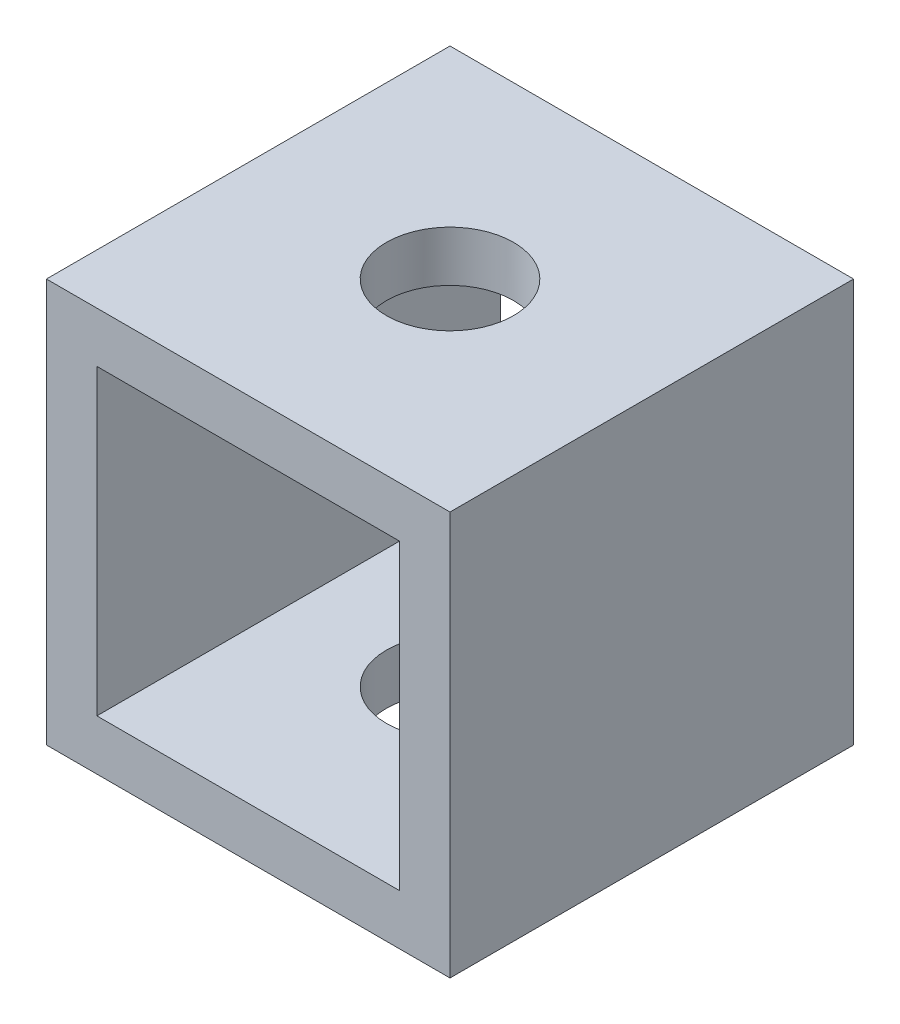
ISO-10303-21;
HEADER;
FILE_DESCRIPTION(('STEP AP214'),'2;1');
FILE_NAME('part.step','',(''),(''),'','','');
FILE_SCHEMA(('AUTOMOTIVE_DESIGN { 1 0 10303 214 1 1 1 1 }'));
ENDSEC;
DATA;
#1=APPLICATION_CONTEXT('core data for automotive mechanical design processes');
#2=APPLICATION_PROTOCOL_DEFINITION('international standard','automotive_design',2000,#1);
#3=PRODUCT_CONTEXT('',#1,'mechanical');
#4=PRODUCT('Part','Part','',(#3));
#5=PRODUCT_RELATED_PRODUCT_CATEGORY('part','',(#4));
#6=PRODUCT_DEFINITION_FORMATION('','',#4);
#7=PRODUCT_DEFINITION_CONTEXT('part definition',#1,'design');
#8=PRODUCT_DEFINITION('design','',#6,#7);
#9=PRODUCT_DEFINITION_SHAPE('','',#8);
#10=(LENGTH_UNIT() NAMED_UNIT(*) SI_UNIT(.MILLI.,.METRE.));
#11=(NAMED_UNIT(*) PLANE_ANGLE_UNIT() SI_UNIT($,.RADIAN.));
#12=(NAMED_UNIT(*) SI_UNIT($,.STERADIAN.) SOLID_ANGLE_UNIT());
#13=UNCERTAINTY_MEASURE_WITH_UNIT(LENGTH_MEASURE(1.E-05),#10,'distance_accuracy_value','');
#14=(GEOMETRIC_REPRESENTATION_CONTEXT(3) GLOBAL_UNCERTAINTY_ASSIGNED_CONTEXT((#13)) GLOBAL_UNIT_ASSIGNED_CONTEXT((#10,
#11,#12)) REPRESENTATION_CONTEXT('',''));
#15=CARTESIAN_POINT('',(0.,0.,0.));
#16=DIRECTION('',(0.,0.,1.));
#17=DIRECTION('',(1.,0.,0.));
#18=AXIS2_PLACEMENT_3D('',#15,#16,#17);
#19=CARTESIAN_POINT('',(0.,0.,25.4));
#20=DIRECTION('',(0.,0.,1.));
#21=DIRECTION('',(1.,0.,0.));
#22=AXIS2_PLACEMENT_3D('',#19,#20,#21);
#23=PLANE('',#22);
#24=DIRECTION('',(0.,1.,0.));
#25=VECTOR('',#24,1.);
#26=CARTESIAN_POINT('',(0.,0.,25.4));
#27=LINE('',#26,#25);
#28=CARTESIAN_POINT('',(0.,0.,25.4));
#29=VERTEX_POINT('',#28);
#30=CARTESIAN_POINT('',(0.,25.4,25.4));
#31=VERTEX_POINT('',#30);
#32=EDGE_CURVE('E156',#29,#31,#27,.T.);
#33=ORIENTED_EDGE('',*,*,#32,.T.);
#34=DIRECTION('',(-1.,0.,0.));
#35=VECTOR('',#34,1.);
#36=CARTESIAN_POINT('',(0.,25.4,25.4));
#37=LINE('',#36,#35);
#38=CARTESIAN_POINT('',(-25.4,25.4,25.4));
#39=VERTEX_POINT('',#38);
#40=EDGE_CURVE('E160',#31,#39,#37,.T.);
#41=ORIENTED_EDGE('',*,*,#40,.T.);
#42=DIRECTION('',(0.,-1.,0.));
#43=VECTOR('',#42,1.);
#44=CARTESIAN_POINT('',(-25.4,0.,25.4));
#45=LINE('',#44,#43);
#46=CARTESIAN_POINT('',(-25.4,0.,25.4));
#47=VERTEX_POINT('',#46);
#48=EDGE_CURVE('E164',#39,#47,#45,.T.);
#49=ORIENTED_EDGE('',*,*,#48,.T.);
#50=DIRECTION('',(1.,0.,0.));
#51=VECTOR('',#50,1.);
#52=CARTESIAN_POINT('',(0.,0.,25.4));
#53=LINE('',#52,#51);
#54=EDGE_CURVE('E167',#47,#29,#53,.T.);
#55=ORIENTED_EDGE('',*,*,#54,.T.);
#56=EDGE_LOOP('',(#33,#41,#49,#55));
#57=FACE_BOUND('',#56,.T.);
#58=DIRECTION('',(1.,0.,0.));
#59=VECTOR('',#58,1.);
#60=CARTESIAN_POINT('',(-22.225,3.175,25.4));
#61=LINE('',#60,#59);
#62=CARTESIAN_POINT('',(-22.225,3.175,25.4));
#63=VERTEX_POINT('',#62);
#64=CARTESIAN_POINT('',(-3.175,3.175,25.4));
#65=VERTEX_POINT('',#64);
#66=EDGE_CURVE('E115',#63,#65,#61,.T.);
#67=ORIENTED_EDGE('',*,*,#66,.F.);
#68=DIRECTION('',(0.,-1.,0.));
#69=VECTOR('',#68,1.);
#70=CARTESIAN_POINT('',(-22.225,22.225,25.4));
#71=LINE('',#70,#69);
#72=CARTESIAN_POINT('',(-22.225,22.225,25.4));
#73=VERTEX_POINT('',#72);
#74=EDGE_CURVE('E106',#73,#63,#71,.T.);
#75=ORIENTED_EDGE('',*,*,#74,.F.);
#76=DIRECTION('',(-1.,0.,0.));
#77=VECTOR('',#76,1.);
#78=CARTESIAN_POINT('',(-22.225,22.225,25.4));
#79=LINE('',#78,#77);
#80=CARTESIAN_POINT('',(-3.175,22.225,25.4));
#81=VERTEX_POINT('',#80);
#82=EDGE_CURVE('E132',#81,#73,#79,.T.);
#83=ORIENTED_EDGE('',*,*,#82,.F.);
#84=DIRECTION('',(0.,1.,0.));
#85=VECTOR('',#84,1.);
#86=CARTESIAN_POINT('',(-3.175,22.225,25.4));
#87=LINE('',#86,#85);
#88=EDGE_CURVE('E128',#65,#81,#87,.T.);
#89=ORIENTED_EDGE('',*,*,#88,.F.);
#90=EDGE_LOOP('',(#67,#75,#83,#89));
#91=FACE_BOUND('',#90,.T.);
#92=ADVANCED_FACE('F39',(#57,#91),#23,.T.);
#93=CARTESIAN_POINT('',(0.,0.,0.));
#94=DIRECTION('',(0.,0.,1.));
#95=DIRECTION('',(1.,0.,0.));
#96=AXIS2_PLACEMENT_3D('',#93,#94,#95);
#97=PLANE('',#96);
#98=DIRECTION('',(0.,1.,0.));
#99=VECTOR('',#98,1.);
#100=CARTESIAN_POINT('',(0.,0.,0.));
#101=LINE('',#100,#99);
#102=CARTESIAN_POINT('',(0.,0.,0.));
#103=VERTEX_POINT('',#102);
#104=CARTESIAN_POINT('',(0.,25.4,0.));
#105=VERTEX_POINT('',#104);
#106=EDGE_CURVE('E124',#103,#105,#101,.T.);
#107=ORIENTED_EDGE('',*,*,#106,.F.);
#108=DIRECTION('',(1.,0.,0.));
#109=VECTOR('',#108,1.);
#110=CARTESIAN_POINT('',(0.,0.,0.));
#111=LINE('',#110,#109);
#112=CARTESIAN_POINT('',(-25.4,0.,0.));
#113=VERTEX_POINT('',#112);
#114=EDGE_CURVE('E161',#113,#103,#111,.T.);
#115=ORIENTED_EDGE('',*,*,#114,.F.);
#116=DIRECTION('',(0.,-1.,0.));
#117=VECTOR('',#116,1.);
#118=CARTESIAN_POINT('',(-25.4,0.,0.));
#119=LINE('',#118,#117);
#120=CARTESIAN_POINT('',(-25.4,25.4,0.));
#121=VERTEX_POINT('',#120);
#122=EDGE_CURVE('E177',#121,#113,#119,.T.);
#123=ORIENTED_EDGE('',*,*,#122,.F.);
#124=DIRECTION('',(-1.,0.,0.));
#125=VECTOR('',#124,1.);
#126=CARTESIAN_POINT('',(0.,25.4,0.));
#127=LINE('',#126,#125);
#128=EDGE_CURVE('E174',#105,#121,#127,.T.);
#129=ORIENTED_EDGE('',*,*,#128,.F.);
#130=EDGE_LOOP('',(#107,#115,#123,#129));
#131=FACE_BOUND('',#130,.T.);
#132=DIRECTION('',(0.,-1.,0.));
#133=VECTOR('',#132,1.);
#134=CARTESIAN_POINT('',(-22.225,22.225,0.));
#135=LINE('',#134,#133);
#136=CARTESIAN_POINT('',(-22.225,22.225,0.));
#137=VERTEX_POINT('',#136);
#138=CARTESIAN_POINT('',(-22.225,3.175,0.));
#139=VERTEX_POINT('',#138);
#140=EDGE_CURVE('E64',#137,#139,#135,.T.);
#141=ORIENTED_EDGE('',*,*,#140,.T.);
#142=DIRECTION('',(1.,0.,0.));
#143=VECTOR('',#142,1.);
#144=CARTESIAN_POINT('',(-22.225,3.175,0.));
#145=LINE('',#144,#143);
#146=CARTESIAN_POINT('',(-3.175,3.175,0.));
#147=VERTEX_POINT('',#146);
#148=EDGE_CURVE('E122',#139,#147,#145,.T.);
#149=ORIENTED_EDGE('',*,*,#148,.T.);
#150=DIRECTION('',(0.,1.,0.));
#151=VECTOR('',#150,1.);
#152=CARTESIAN_POINT('',(-3.175,22.225,0.));
#153=LINE('',#152,#151);
#154=CARTESIAN_POINT('',(-3.175,22.225,0.));
#155=VERTEX_POINT('',#154);
#156=EDGE_CURVE('E143',#147,#155,#153,.T.);
#157=ORIENTED_EDGE('',*,*,#156,.T.);
#158=DIRECTION('',(-1.,0.,0.));
#159=VECTOR('',#158,1.);
#160=CARTESIAN_POINT('',(-22.225,22.225,0.));
#161=LINE('',#160,#159);
#162=EDGE_CURVE('E116',#155,#137,#161,.T.);
#163=ORIENTED_EDGE('',*,*,#162,.T.);
#164=EDGE_LOOP('',(#141,#149,#157,#163));
#165=FACE_BOUND('',#164,.T.);
#166=ADVANCED_FACE('F201',(#131,#165),#97,.F.);
#167=CARTESIAN_POINT('',(0.,0.,25.4));
#168=DIRECTION('',(-1.,0.,0.));
#169=DIRECTION('',(0.,-1.,0.));
#170=AXIS2_PLACEMENT_3D('',#167,#168,#169);
#171=PLANE('',#170);
#172=ORIENTED_EDGE('',*,*,#106,.T.);
#173=DIRECTION('',(0.,0.,-1.));
#174=VECTOR('',#173,1.);
#175=CARTESIAN_POINT('',(0.,25.4,25.4));
#176=LINE('',#175,#174);
#177=EDGE_CURVE('E11',#31,#105,#176,.T.);
#178=ORIENTED_EDGE('',*,*,#177,.F.);
#179=ORIENTED_EDGE('',*,*,#32,.F.);
#180=DIRECTION('',(0.,0.,-1.));
#181=VECTOR('',#180,1.);
#182=CARTESIAN_POINT('',(0.,0.,25.4));
#183=LINE('',#182,#181);
#184=EDGE_CURVE('E170',#29,#103,#183,.T.);
#185=ORIENTED_EDGE('',*,*,#184,.T.);
#186=EDGE_LOOP('',(#172,#178,#179,#185));
#187=FACE_BOUND('',#186,.T.);
#188=ADVANCED_FACE('F41',(#187),#171,.F.);
#189=CARTESIAN_POINT('',(0.,25.4,25.4));
#190=DIRECTION('',(0.,-1.,0.));
#191=DIRECTION('',(1.,0.,0.));
#192=AXIS2_PLACEMENT_3D('',#189,#190,#191);
#193=PLANE('',#192);
#194=CARTESIAN_POINT('',(-12.7,25.4,12.7));
#195=DIRECTION('',(0.,1.,0.));
#196=DIRECTION('',(-1.,0.,0.));
#197=AXIS2_PLACEMENT_3D('',#194,#195,#196);
#198=CIRCLE('',#197,4.);
#199=CARTESIAN_POINT('',(-16.7,25.4,12.7));
#200=VERTEX_POINT('',#199);
#201=EDGE_CURVE('E239',#200,#200,#198,.T.);
#202=ORIENTED_EDGE('',*,*,#201,.F.);
#203=EDGE_LOOP('',(#202));
#204=FACE_BOUND('',#203,.T.);
#205=ORIENTED_EDGE('',*,*,#128,.T.);
#206=DIRECTION('',(0.,0.,-1.));
#207=VECTOR('',#206,1.);
#208=CARTESIAN_POINT('',(-25.4,25.4,25.4));
#209=LINE('',#208,#207);
#210=EDGE_CURVE('E49',#39,#121,#209,.T.);
#211=ORIENTED_EDGE('',*,*,#210,.F.);
#212=ORIENTED_EDGE('',*,*,#40,.F.);
#213=ORIENTED_EDGE('',*,*,#177,.T.);
#214=EDGE_LOOP('',(#205,#211,#212,#213));
#215=FACE_BOUND('',#214,.T.);
#216=ADVANCED_FACE('F211',(#204,#215),#193,.F.);
#217=CARTESIAN_POINT('',(-25.4,0.,25.4));
#218=DIRECTION('',(1.,0.,0.));
#219=DIRECTION('',(0.,0.,-1.));
#220=AXIS2_PLACEMENT_3D('',#217,#218,#219);
#221=PLANE('',#220);
#222=ORIENTED_EDGE('',*,*,#122,.T.);
#223=DIRECTION('',(0.,0.,-1.));
#224=VECTOR('',#223,1.);
#225=CARTESIAN_POINT('',(-25.4,0.,25.4));
#226=LINE('',#225,#224);
#227=EDGE_CURVE('E185',#47,#113,#226,.T.);
#228=ORIENTED_EDGE('',*,*,#227,.F.);
#229=ORIENTED_EDGE('',*,*,#48,.F.);
#230=ORIENTED_EDGE('',*,*,#210,.T.);
#231=EDGE_LOOP('',(#222,#228,#229,#230));
#232=FACE_BOUND('',#231,.T.);
#233=ADVANCED_FACE('F195',(#232),#221,.F.);
#234=CARTESIAN_POINT('',(0.,0.,25.4));
#235=DIRECTION('',(0.,1.,0.));
#236=DIRECTION('',(0.,0.,1.));
#237=AXIS2_PLACEMENT_3D('',#234,#235,#236);
#238=PLANE('',#237);
#239=CARTESIAN_POINT('',(-12.7,0.,12.7));
#240=DIRECTION('',(0.,1.,0.));
#241=DIRECTION('',(-1.,0.,0.));
#242=AXIS2_PLACEMENT_3D('',#239,#240,#241);
#243=CIRCLE('',#242,4.);
#244=CARTESIAN_POINT('',(-16.7,0.,12.7));
#245=VERTEX_POINT('',#244);
#246=EDGE_CURVE('E236',#245,#245,#243,.T.);
#247=ORIENTED_EDGE('',*,*,#246,.T.);
#248=EDGE_LOOP('',(#247));
#249=FACE_BOUND('',#248,.T.);
#250=ORIENTED_EDGE('',*,*,#114,.T.);
#251=ORIENTED_EDGE('',*,*,#184,.F.);
#252=ORIENTED_EDGE('',*,*,#54,.F.);
#253=ORIENTED_EDGE('',*,*,#227,.T.);
#254=EDGE_LOOP('',(#250,#251,#252,#253));
#255=FACE_BOUND('',#254,.T.);
#256=ADVANCED_FACE('F205',(#249,#255),#238,.F.);
#257=CARTESIAN_POINT('',(-22.225,22.225,25.4));
#258=DIRECTION('',(1.,0.,0.));
#259=DIRECTION('',(0.,1.,0.));
#260=AXIS2_PLACEMENT_3D('',#257,#258,#259);
#261=PLANE('',#260);
#262=ORIENTED_EDGE('',*,*,#140,.F.);
#263=DIRECTION('',(0.,0.,-1.));
#264=VECTOR('',#263,1.);
#265=CARTESIAN_POINT('',(-22.225,22.225,25.4));
#266=LINE('',#265,#264);
#267=EDGE_CURVE('E110',#73,#137,#266,.T.);
#268=ORIENTED_EDGE('',*,*,#267,.F.);
#269=ORIENTED_EDGE('',*,*,#74,.T.);
#270=DIRECTION('',(0.,0.,-1.));
#271=VECTOR('',#270,1.);
#272=CARTESIAN_POINT('',(-22.225,3.175,25.4));
#273=LINE('',#272,#271);
#274=EDGE_CURVE('E109',#63,#139,#273,.T.);
#275=ORIENTED_EDGE('',*,*,#274,.T.);
#276=EDGE_LOOP('',(#262,#268,#269,#275));
#277=FACE_BOUND('',#276,.T.);
#278=ADVANCED_FACE('F108',(#277),#261,.T.);
#279=CARTESIAN_POINT('',(-22.225,3.175,25.4));
#280=DIRECTION('',(0.,1.,0.));
#281=DIRECTION('',(0.,0.,1.));
#282=AXIS2_PLACEMENT_3D('',#279,#280,#281);
#283=PLANE('',#282);
#284=CARTESIAN_POINT('',(-12.7,3.175,12.7));
#285=DIRECTION('',(0.,1.,0.));
#286=DIRECTION('',(0.,0.,1.));
#287=AXIS2_PLACEMENT_3D('',#284,#285,#286);
#288=CIRCLE('',#287,4.);
#289=CARTESIAN_POINT('',(-12.7,3.175,16.7));
#290=VERTEX_POINT('',#289);
#291=EDGE_CURVE('E140',#290,#290,#288,.T.);
#292=ORIENTED_EDGE('',*,*,#291,.F.);
#293=EDGE_LOOP('',(#292));
#294=FACE_BOUND('',#293,.T.);
#295=ORIENTED_EDGE('',*,*,#148,.F.);
#296=ORIENTED_EDGE('',*,*,#274,.F.);
#297=ORIENTED_EDGE('',*,*,#66,.T.);
#298=DIRECTION('',(0.,0.,-1.));
#299=VECTOR('',#298,1.);
#300=CARTESIAN_POINT('',(-3.175,3.175,25.4));
#301=LINE('',#300,#299);
#302=EDGE_CURVE('E125',#65,#147,#301,.T.);
#303=ORIENTED_EDGE('',*,*,#302,.T.);
#304=EDGE_LOOP('',(#295,#296,#297,#303));
#305=FACE_BOUND('',#304,.T.);
#306=ADVANCED_FACE('F119',(#294,#305),#283,.T.);
#307=CARTESIAN_POINT('',(-3.175,22.225,25.4));
#308=DIRECTION('',(-1.,0.,0.));
#309=DIRECTION('',(0.,-1.,0.));
#310=AXIS2_PLACEMENT_3D('',#307,#308,#309);
#311=PLANE('',#310);
#312=ORIENTED_EDGE('',*,*,#156,.F.);
#313=ORIENTED_EDGE('',*,*,#302,.F.);
#314=ORIENTED_EDGE('',*,*,#88,.T.);
#315=DIRECTION('',(0.,0.,-1.));
#316=VECTOR('',#315,1.);
#317=CARTESIAN_POINT('',(-3.175,22.225,25.4));
#318=LINE('',#317,#316);
#319=EDGE_CURVE('E56',#81,#155,#318,.T.);
#320=ORIENTED_EDGE('',*,*,#319,.T.);
#321=EDGE_LOOP('',(#312,#313,#314,#320));
#322=FACE_BOUND('',#321,.T.);
#323=ADVANCED_FACE('F253',(#322),#311,.T.);
#324=CARTESIAN_POINT('',(-22.225,22.225,25.4));
#325=DIRECTION('',(0.,-1.,0.));
#326=DIRECTION('',(0.,0.,-1.));
#327=AXIS2_PLACEMENT_3D('',#324,#325,#326);
#328=PLANE('',#327);
#329=CARTESIAN_POINT('',(-12.7,22.225,12.7));
#330=DIRECTION('',(0.,-1.,0.));
#331=DIRECTION('',(0.,0.,-1.));
#332=AXIS2_PLACEMENT_3D('',#329,#330,#331);
#333=CIRCLE('',#332,4.);
#334=CARTESIAN_POINT('',(-12.7,22.225,8.7));
#335=VERTEX_POINT('',#334);
#336=EDGE_CURVE('E43',#335,#335,#333,.T.);
#337=ORIENTED_EDGE('',*,*,#336,.F.);
#338=EDGE_LOOP('',(#337));
#339=FACE_BOUND('',#338,.T.);
#340=ORIENTED_EDGE('',*,*,#162,.F.);
#341=ORIENTED_EDGE('',*,*,#319,.F.);
#342=ORIENTED_EDGE('',*,*,#82,.T.);
#343=ORIENTED_EDGE('',*,*,#267,.T.);
#344=EDGE_LOOP('',(#340,#341,#342,#343));
#345=FACE_BOUND('',#344,.T.);
#346=ADVANCED_FACE('F257',(#339,#345),#328,.T.);
#347=CARTESIAN_POINT('',(-12.7,0.,12.7));
#348=DIRECTION('',(0.,1.,0.));
#349=DIRECTION('',(-1.,0.,0.));
#350=AXIS2_PLACEMENT_3D('',#347,#348,#349);
#351=CYLINDRICAL_SURFACE('',#350,4.);
#352=ORIENTED_EDGE('',*,*,#336,.T.);
#353=EDGE_LOOP('',(#352));
#354=FACE_BOUND('',#353,.T.);
#355=ORIENTED_EDGE('',*,*,#201,.T.);
#356=EDGE_LOOP('',(#355));
#357=FACE_BOUND('',#356,.T.);
#358=ADVANCED_FACE('F263',(#354,#357),#351,.F.);
#359=ORIENTED_EDGE('',*,*,#291,.T.);
#360=EDGE_LOOP('',(#359));
#361=FACE_BOUND('',#360,.T.);
#362=ORIENTED_EDGE('',*,*,#246,.F.);
#363=EDGE_LOOP('',(#362));
#364=FACE_BOUND('',#363,.T.);
#365=ADVANCED_FACE('F250',(#361,#364),#351,.F.);
#366=CLOSED_SHELL('',(#92,#166,#188,#216,#233,#256,#278,#306,#323,#346,#358,#365));
#367=MANIFOLD_SOLID_BREP('B2',#366);
#368=ADVANCED_BREP_SHAPE_REPRESENTATION('',(#18,#367),#14);
#369=SHAPE_DEFINITION_REPRESENTATION(#9,#368);
ENDSEC;
END-ISO-10303-21;
